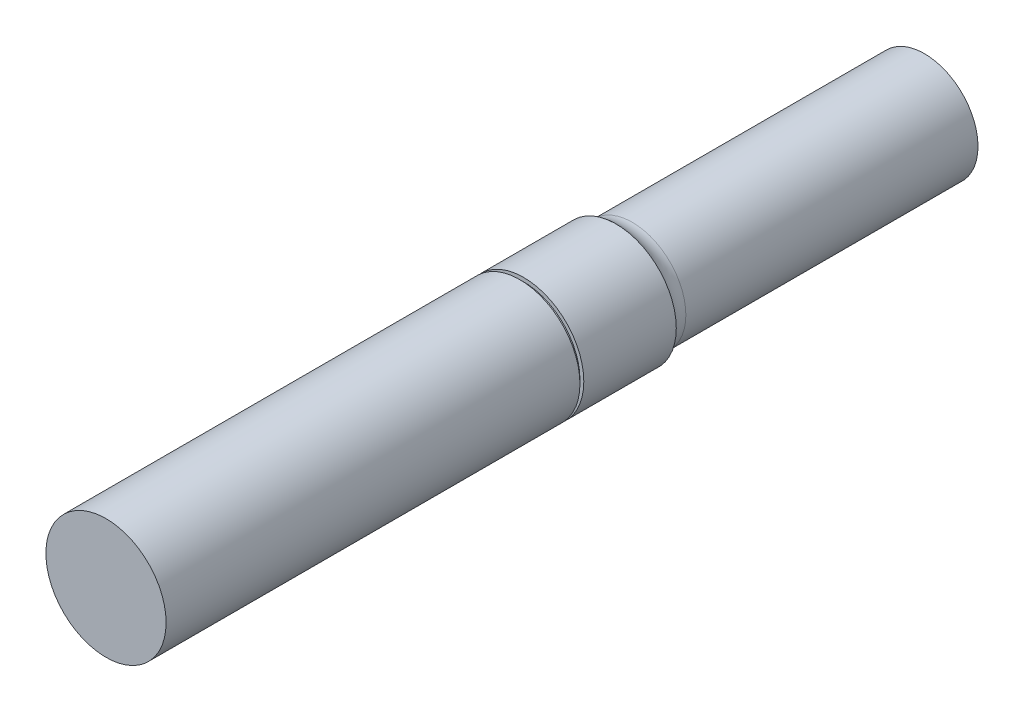
ISO-10303-21;
HEADER;
FILE_DESCRIPTION(('STEP AP214'),'2;1');
FILE_NAME('part.step','',(''),(''),'','','');
FILE_SCHEMA(('AUTOMOTIVE_DESIGN { 1 0 10303 214 1 1 1 1 }'));
ENDSEC;
DATA;
#1=APPLICATION_CONTEXT('core data for automotive mechanical design processes');
#2=APPLICATION_PROTOCOL_DEFINITION('international standard','automotive_design',2000,#1);
#3=PRODUCT_CONTEXT('',#1,'mechanical');
#4=PRODUCT('Part','Part','',(#3));
#5=PRODUCT_RELATED_PRODUCT_CATEGORY('part','',(#4));
#6=PRODUCT_DEFINITION_FORMATION('','',#4);
#7=PRODUCT_DEFINITION_CONTEXT('part definition',#1,'design');
#8=PRODUCT_DEFINITION('design','',#6,#7);
#9=PRODUCT_DEFINITION_SHAPE('','',#8);
#10=(LENGTH_UNIT() NAMED_UNIT(*) SI_UNIT(.MILLI.,.METRE.));
#11=(NAMED_UNIT(*) PLANE_ANGLE_UNIT() SI_UNIT($,.RADIAN.));
#12=(NAMED_UNIT(*) SI_UNIT($,.STERADIAN.) SOLID_ANGLE_UNIT());
#13=UNCERTAINTY_MEASURE_WITH_UNIT(LENGTH_MEASURE(1.E-05),#10,'distance_accuracy_value','');
#14=(GEOMETRIC_REPRESENTATION_CONTEXT(3) GLOBAL_UNCERTAINTY_ASSIGNED_CONTEXT((#13)) GLOBAL_UNIT_ASSIGNED_CONTEXT((#10,
#11,#12)) REPRESENTATION_CONTEXT('',''));
#15=CARTESIAN_POINT('',(0.,0.,0.));
#16=DIRECTION('',(0.,0.,1.));
#17=DIRECTION('',(1.,0.,0.));
#18=AXIS2_PLACEMENT_3D('',#15,#16,#17);
#19=CARTESIAN_POINT('',(0.,0.,127.));
#20=DIRECTION('',(0.,0.,1.));
#21=DIRECTION('',(1.,0.,0.));
#22=AXIS2_PLACEMENT_3D('',#19,#20,#21);
#23=CYLINDRICAL_SURFACE('',#22,1.8542);
#24=CARTESIAN_POINT('',(0.,0.,-0.152399999999997));
#25=DIRECTION('',(0.,0.,1.));
#26=DIRECTION('',(1.,0.,0.));
#27=AXIS2_PLACEMENT_3D('',#24,#25,#26);
#28=CIRCLE('',#27,1.8542);
#29=CARTESIAN_POINT('',(1.8542,0.,-0.152399999999997));
#30=VERTEX_POINT('',#29);
#31=EDGE_CURVE('E79',#30,#30,#28,.T.);
#32=ORIENTED_EDGE('',*,*,#31,.F.);
#33=EDGE_LOOP('',(#32));
#34=FACE_BOUND('',#33,.T.);
#35=CARTESIAN_POINT('',(0.,0.,-0.279400000000013));
#36=DIRECTION('',(0.,0.,1.));
#37=DIRECTION('',(1.,0.,0.));
#38=AXIS2_PLACEMENT_3D('',#35,#36,#37);
#39=CIRCLE('',#38,1.8542);
#40=CARTESIAN_POINT('',(1.8542,0.,-0.279400000000013));
#41=VERTEX_POINT('',#40);
#42=EDGE_CURVE('E59',#41,#41,#39,.T.);
#43=ORIENTED_EDGE('',*,*,#42,.T.);
#44=EDGE_LOOP('',(#43));
#45=FACE_BOUND('',#44,.T.);
#46=ADVANCED_FACE('F38',(#34,#45),#23,.T.);
#47=CARTESIAN_POINT('',(0.,1.9812,-0.15240000000001));
#48=DIRECTION('',(0.,0.,1.));
#49=DIRECTION('',(1.,0.,0.));
#50=AXIS2_PLACEMENT_3D('',#47,#48,#49);
#51=PLANE('',#50);
#52=CARTESIAN_POINT('',(0.,0.,-0.152399999999997));
#53=DIRECTION('',(0.,0.,1.));
#54=DIRECTION('',(1.,0.,0.));
#55=AXIS2_PLACEMENT_3D('',#52,#53,#54);
#56=CIRCLE('',#55,1.9812);
#57=CARTESIAN_POINT('',(1.9812,0.,-0.152399999999997));
#58=VERTEX_POINT('',#57);
#59=EDGE_CURVE('E76',#58,#58,#56,.T.);
#60=ORIENTED_EDGE('',*,*,#59,.F.);
#61=EDGE_LOOP('',(#60));
#62=FACE_BOUND('',#61,.T.);
#63=ORIENTED_EDGE('',*,*,#31,.T.);
#64=EDGE_LOOP('',(#63));
#65=FACE_BOUND('',#64,.T.);
#66=ADVANCED_FACE('F96',(#62,#65),#51,.F.);
#67=CARTESIAN_POINT('',(0.,0.,127.));
#68=DIRECTION('',(0.,0.,1.));
#69=DIRECTION('',(1.,0.,0.));
#70=AXIS2_PLACEMENT_3D('',#67,#68,#69);
#71=CYLINDRICAL_SURFACE('',#70,1.9812);
#72=CARTESIAN_POINT('',(0.,0.,13.4874));
#73=DIRECTION('',(0.,0.,1.));
#74=DIRECTION('',(1.,0.,0.));
#75=AXIS2_PLACEMENT_3D('',#72,#73,#74);
#76=CIRCLE('',#75,1.9812);
#77=CARTESIAN_POINT('',(1.9812,0.,13.4874));
#78=VERTEX_POINT('',#77);
#79=EDGE_CURVE('E73',#78,#78,#76,.T.);
#80=ORIENTED_EDGE('',*,*,#79,.F.);
#81=EDGE_LOOP('',(#80));
#82=FACE_BOUND('',#81,.T.);
#83=ORIENTED_EDGE('',*,*,#59,.T.);
#84=EDGE_LOOP('',(#83));
#85=FACE_BOUND('',#84,.T.);
#86=ADVANCED_FACE('F102',(#82,#85),#71,.T.);
#87=CARTESIAN_POINT('',(0.,0.,13.4874));
#88=DIRECTION('',(0.,0.,-1.));
#89=DIRECTION('',(-1.,0.,0.));
#90=AXIS2_PLACEMENT_3D('',#87,#88,#89);
#91=PLANE('',#90);
#92=ORIENTED_EDGE('',*,*,#79,.T.);
#93=EDGE_LOOP('',(#92));
#94=FACE_BOUND('',#93,.T.);
#95=ADVANCED_FACE('F135',(#94),#91,.F.);
#96=CARTESIAN_POINT('',(0.,1.7653,-13.4874));
#97=DIRECTION('',(0.,0.,1.));
#98=DIRECTION('',(1.,0.,0.));
#99=AXIS2_PLACEMENT_3D('',#96,#97,#98);
#100=PLANE('',#99);
#101=CARTESIAN_POINT('',(0.,0.,-13.4874));
#102=DIRECTION('',(0.,0.,1.));
#103=DIRECTION('',(1.,0.,0.));
#104=AXIS2_PLACEMENT_3D('',#101,#102,#103);
#105=CIRCLE('',#104,1.5875);
#106=CARTESIAN_POINT('',(1.5875,0.,-13.4874));
#107=VERTEX_POINT('',#106);
#108=EDGE_CURVE('E11',#107,#107,#105,.T.);
#109=ORIENTED_EDGE('',*,*,#108,.T.);
#110=EDGE_LOOP('',(#109));
#111=FACE_BOUND('',#110,.T.);
#112=CARTESIAN_POINT('',(0.,0.,-13.4874));
#113=DIRECTION('',(0.,0.,1.));
#114=DIRECTION('',(1.,0.,0.));
#115=AXIS2_PLACEMENT_3D('',#112,#113,#114);
#116=CIRCLE('',#115,1.7653);
#117=CARTESIAN_POINT('',(1.7653,0.,-13.4874));
#118=VERTEX_POINT('',#117);
#119=EDGE_CURVE('E70',#118,#118,#116,.T.);
#120=ORIENTED_EDGE('',*,*,#119,.F.);
#121=EDGE_LOOP('',(#120));
#122=FACE_BOUND('',#121,.T.);
#123=ADVANCED_FACE('F128',(#111,#122),#100,.F.);
#124=CARTESIAN_POINT('',(0.,0.,127.));
#125=DIRECTION('',(0.,0.,1.));
#126=DIRECTION('',(1.,0.,0.));
#127=AXIS2_PLACEMENT_3D('',#124,#125,#126);
#128=CYLINDRICAL_SURFACE('',#127,1.7653);
#129=CARTESIAN_POINT('',(0.,0.,-3.85883088920386));
#130=DIRECTION('',(0.,0.,1.));
#131=DIRECTION('',(1.,0.,0.));
#132=AXIS2_PLACEMENT_3D('',#129,#130,#131);
#133=CIRCLE('',#132,1.7653);
#134=CARTESIAN_POINT('',(1.7653,0.,-3.85883088920386));
#135=VERTEX_POINT('',#134);
#136=EDGE_CURVE('E82',#135,#135,#133,.F.);
#137=ORIENTED_EDGE('',*,*,#136,.T.);
#138=EDGE_LOOP('',(#137));
#139=FACE_BOUND('',#138,.T.);
#140=ORIENTED_EDGE('',*,*,#119,.T.);
#141=EDGE_LOOP('',(#140));
#142=FACE_BOUND('',#141,.T.);
#143=ADVANCED_FACE('F122',(#139,#142),#128,.T.);
#144=CARTESIAN_POINT('',(0.,0.,127.));
#145=DIRECTION('',(0.,0.,1.));
#146=DIRECTION('',(1.,0.,0.));
#147=AXIS2_PLACEMENT_3D('',#144,#145,#146);
#148=CYLINDRICAL_SURFACE('',#147,1.9812);
#149=CARTESIAN_POINT('',(0.,0.,-0.279400000000013));
#150=DIRECTION('',(0.,0.,1.));
#151=DIRECTION('',(1.,0.,0.));
#152=AXIS2_PLACEMENT_3D('',#149,#150,#151);
#153=CIRCLE('',#152,1.9812);
#154=CARTESIAN_POINT('',(1.9812,0.,-0.279400000000013));
#155=VERTEX_POINT('',#154);
#156=EDGE_CURVE('E62',#155,#155,#153,.T.);
#157=ORIENTED_EDGE('',*,*,#156,.F.);
#158=EDGE_LOOP('',(#157));
#159=FACE_BOUND('',#158,.T.);
#160=CARTESIAN_POINT('',(0.,0.,-3.32740000000001));
#161=DIRECTION('',(0.,0.,1.));
#162=DIRECTION('',(1.,0.,0.));
#163=AXIS2_PLACEMENT_3D('',#160,#161,#162);
#164=CIRCLE('',#163,1.9812);
#165=CARTESIAN_POINT('',(1.9812,0.,-3.32740000000001));
#166=VERTEX_POINT('',#165);
#167=EDGE_CURVE('E67',#166,#166,#164,.T.);
#168=ORIENTED_EDGE('',*,*,#167,.T.);
#169=EDGE_LOOP('',(#168));
#170=FACE_BOUND('',#169,.T.);
#171=ADVANCED_FACE('F114',(#159,#170),#148,.T.);
#172=CARTESIAN_POINT('',(0.,1.8542,-0.27940000000001));
#173=DIRECTION('',(0.,0.,-1.));
#174=DIRECTION('',(-1.,0.,0.));
#175=AXIS2_PLACEMENT_3D('',#172,#173,#174);
#176=PLANE('',#175);
#177=ORIENTED_EDGE('',*,*,#42,.F.);
#178=EDGE_LOOP('',(#177));
#179=FACE_BOUND('',#178,.T.);
#180=ORIENTED_EDGE('',*,*,#156,.T.);
#181=EDGE_LOOP('',(#180));
#182=FACE_BOUND('',#181,.T.);
#183=ADVANCED_FACE('F109',(#179,#182),#176,.F.);
#184=CARTESIAN_POINT('',(0.,0.,-3.85883088920386));
#185=DIRECTION('',(0.,0.,1.));
#186=DIRECTION('',(1.,0.,0.));
#187=AXIS2_PLACEMENT_3D('',#184,#185,#186);
#188=TOROIDAL_SURFACE('',#187,2.5273,0.762);
#189=ORIENTED_EDGE('',*,*,#136,.F.);
#190=EDGE_LOOP('',(#189));
#191=FACE_BOUND('',#190,.T.);
#192=ORIENTED_EDGE('',*,*,#167,.F.);
#193=EDGE_LOOP('',(#192));
#194=FACE_BOUND('',#193,.T.);
#195=ADVANCED_FACE('F53',(#191,#194),#188,.F.);
#196=CARTESIAN_POINT('',(0.,0.,-12.3698));
#197=DIRECTION('',(0.,0.,-1.));
#198=DIRECTION('',(-1.,0.,0.));
#199=AXIS2_PLACEMENT_3D('',#196,#197,#198);
#200=CONICAL_SURFACE('',#199,0.7493,1.02974425867665);
#201=CARTESIAN_POINT('',(0.,0.,-11.9195751381627));
#202=VERTEX_POINT('',#201);
#203=VERTEX_LOOP('',#202);
#204=FACE_BOUND('',#203,.T.);
#205=CARTESIAN_POINT('',(0.,0.,-12.3698));
#206=DIRECTION('',(0.,0.,-1.));
#207=DIRECTION('',(-1.,0.,0.));
#208=AXIS2_PLACEMENT_3D('',#205,#206,#207);
#209=CIRCLE('',#208,0.7493);
#210=CARTESIAN_POINT('',(-0.7493,0.,-12.3698));
#211=VERTEX_POINT('',#210);
#212=EDGE_CURVE('E57',#211,#211,#209,.T.);
#213=ORIENTED_EDGE('',*,*,#212,.T.);
#214=EDGE_LOOP('',(#213));
#215=FACE_BOUND('',#214,.T.);
#216=ADVANCED_FACE('F49',(#204,#215),#200,.F.);
#217=CARTESIAN_POINT('',(0.,0.,-13.4874));
#218=DIRECTION('',(0.,0.,-1.));
#219=DIRECTION('',(-1.,0.,0.));
#220=AXIS2_PLACEMENT_3D('',#217,#218,#219);
#221=CYLINDRICAL_SURFACE('',#220,0.749299999999998);
#222=CARTESIAN_POINT('',(0.,0.,-13.0034650043653));
#223=DIRECTION('',(0.,0.,1.));
#224=DIRECTION('',(1.,0.,0.));
#225=AXIS2_PLACEMENT_3D('',#222,#223,#224);
#226=CIRCLE('',#225,0.749299999999998);
#227=CARTESIAN_POINT('',(0.749299999999998,0.,-13.0034650043653));
#228=VERTEX_POINT('',#227);
#229=EDGE_CURVE('E46',#228,#228,#226,.F.);
#230=ORIENTED_EDGE('',*,*,#229,.T.);
#231=EDGE_LOOP('',(#230));
#232=FACE_BOUND('',#231,.T.);
#233=ORIENTED_EDGE('',*,*,#212,.F.);
#234=EDGE_LOOP('',(#233));
#235=FACE_BOUND('',#234,.T.);
#236=ADVANCED_FACE('F52',(#232,#235),#221,.F.);
#237=CARTESIAN_POINT('',(0.,0.,-13.0034650043653));
#238=DIRECTION('',(0.,0.,-1.));
#239=DIRECTION('',(-1.,0.,0.));
#240=AXIS2_PLACEMENT_3D('',#237,#238,#239);
#241=CONICAL_SURFACE('',#240,0.749299999999998,1.0471975511966);
#242=ORIENTED_EDGE('',*,*,#108,.F.);
#243=EDGE_LOOP('',(#242));
#244=FACE_BOUND('',#243,.T.);
#245=ORIENTED_EDGE('',*,*,#229,.F.);
#246=EDGE_LOOP('',(#245));
#247=FACE_BOUND('',#246,.T.);
#248=ADVANCED_FACE('F41',(#244,#247),#241,.F.);
#249=CLOSED_SHELL('',(#46,#66,#86,#95,#123,#143,#171,#183,#195,#216,#236,#248));
#250=MANIFOLD_SOLID_BREP('B2',#249);
#251=ADVANCED_BREP_SHAPE_REPRESENTATION('',(#18,#250),#14);
#252=SHAPE_DEFINITION_REPRESENTATION(#9,#251);
ENDSEC;
END-ISO-10303-21;
